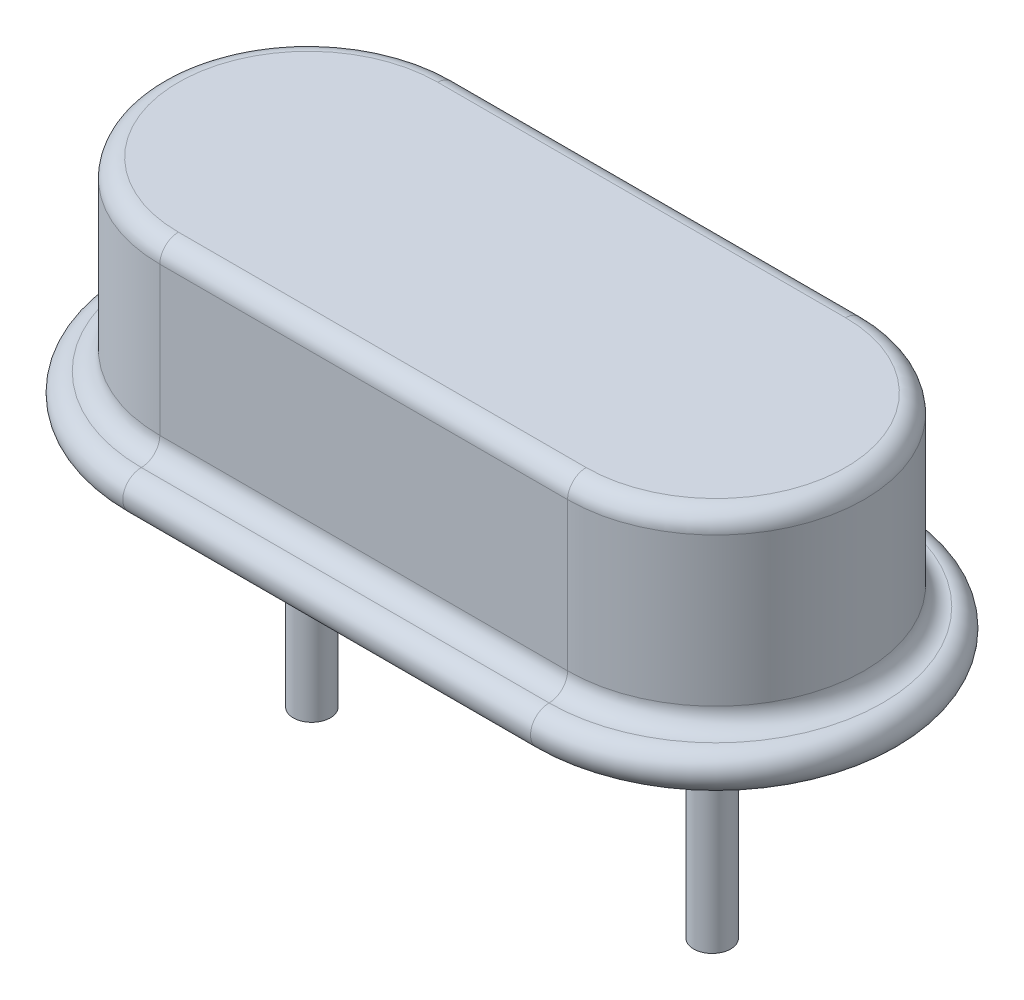
ISO-10303-21;
HEADER;
FILE_DESCRIPTION(('STEP AP214'),'2;1');
FILE_NAME('part.step','',(''),(''),'','','');
FILE_SCHEMA(('AUTOMOTIVE_DESIGN { 1 0 10303 214 1 1 1 1 }'));
ENDSEC;
DATA;
#1=APPLICATION_CONTEXT('core data for automotive mechanical design processes');
#2=APPLICATION_PROTOCOL_DEFINITION('international standard','automotive_design',2000,#1);
#3=PRODUCT_CONTEXT('',#1,'mechanical');
#4=PRODUCT('Part','Part','',(#3));
#5=PRODUCT_RELATED_PRODUCT_CATEGORY('part','',(#4));
#6=PRODUCT_DEFINITION_FORMATION('','',#4);
#7=PRODUCT_DEFINITION_CONTEXT('part definition',#1,'design');
#8=PRODUCT_DEFINITION('design','',#6,#7);
#9=PRODUCT_DEFINITION_SHAPE('','',#8);
#10=(LENGTH_UNIT() NAMED_UNIT(*) SI_UNIT(.MILLI.,.METRE.));
#11=(NAMED_UNIT(*) PLANE_ANGLE_UNIT() SI_UNIT($,.RADIAN.));
#12=(NAMED_UNIT(*) SI_UNIT($,.STERADIAN.) SOLID_ANGLE_UNIT());
#13=UNCERTAINTY_MEASURE_WITH_UNIT(LENGTH_MEASURE(1.E-05),#10,'distance_accuracy_value','');
#14=(GEOMETRIC_REPRESENTATION_CONTEXT(3) GLOBAL_UNCERTAINTY_ASSIGNED_CONTEXT((#13)) GLOBAL_UNIT_ASSIGNED_CONTEXT((#10,
#11,#12)) REPRESENTATION_CONTEXT('',''));
#15=CARTESIAN_POINT('',(0.,0.,0.));
#16=DIRECTION('',(0.,0.,1.));
#17=DIRECTION('',(1.,0.,0.));
#18=AXIS2_PLACEMENT_3D('',#15,#16,#17);
#19=CARTESIAN_POINT('',(0.,3.,0.));
#20=DIRECTION('',(0.,1.,0.));
#21=DIRECTION('',(0.,0.,1.));
#22=AXIS2_PLACEMENT_3D('',#19,#20,#21);
#23=PLANE('',#22);
#24=DIRECTION('',(-1.,0.,0.));
#25=VECTOR('',#24,1.);
#26=CARTESIAN_POINT('',(2.375,3.,-1.75));
#27=LINE('',#26,#25);
#28=CARTESIAN_POINT('',(-2.75,3.,-1.75));
#29=VERTEX_POINT('',#28);
#30=CARTESIAN_POINT('',(2.75,3.,-1.75));
#31=VERTEX_POINT('',#30);
#32=EDGE_CURVE('E110',#29,#31,#27,.F.);
#33=ORIENTED_EDGE('',*,*,#32,.F.);
#34=CARTESIAN_POINT('',(-2.75,3.,0.));
#35=DIRECTION('',(0.,-1.,0.));
#36=DIRECTION('',(0.,0.,1.));
#37=AXIS2_PLACEMENT_3D('',#34,#35,#36);
#38=CIRCLE('',#37,1.75);
#39=CARTESIAN_POINT('',(-2.75,3.,1.75));
#40=VERTEX_POINT('',#39);
#41=EDGE_CURVE('E92',#40,#29,#38,.T.);
#42=ORIENTED_EDGE('',*,*,#41,.F.);
#43=DIRECTION('',(1.,0.,0.));
#44=VECTOR('',#43,1.);
#45=CARTESIAN_POINT('',(-2.375,3.,1.75));
#46=LINE('',#45,#44);
#47=CARTESIAN_POINT('',(2.75,3.,1.75));
#48=VERTEX_POINT('',#47);
#49=EDGE_CURVE('E140',#48,#40,#46,.F.);
#50=ORIENTED_EDGE('',*,*,#49,.F.);
#51=CARTESIAN_POINT('',(2.75,3.,0.));
#52=DIRECTION('',(0.,-1.,0.));
#53=DIRECTION('',(0.,0.,-1.));
#54=AXIS2_PLACEMENT_3D('',#51,#52,#53);
#55=CIRCLE('',#54,1.75);
#56=EDGE_CURVE('E116',#31,#48,#55,.T.);
#57=ORIENTED_EDGE('',*,*,#56,.F.);
#58=EDGE_LOOP('',(#33,#42,#50,#57));
#59=FACE_BOUND('',#58,.T.);
#60=ADVANCED_FACE('F16',(#59),#23,.T.);
#61=CARTESIAN_POINT('',(-2.75,2.75,0.));
#62=DIRECTION('',(0.,-1.,0.));
#63=DIRECTION('',(0.,0.,-1.));
#64=AXIS2_PLACEMENT_3D('',#61,#62,#63);
#65=TOROIDAL_SURFACE('',#64,1.75,0.25);
#66=CARTESIAN_POINT('',(-2.75,2.75,1.75));
#67=DIRECTION('',(1.,0.,0.));
#68=DIRECTION('',(0.,0.,-1.));
#69=AXIS2_PLACEMENT_3D('',#66,#67,#68);
#70=CIRCLE('',#69,0.25);
#71=CARTESIAN_POINT('',(-2.75,2.75,2.));
#72=VERTEX_POINT('',#71);
#73=EDGE_CURVE('E99',#40,#72,#70,.T.);
#74=ORIENTED_EDGE('',*,*,#73,.F.);
#75=ORIENTED_EDGE('',*,*,#41,.T.);
#76=CARTESIAN_POINT('',(-2.75,2.75,-1.75));
#77=DIRECTION('',(-1.,0.,0.));
#78=DIRECTION('',(0.,0.,1.));
#79=AXIS2_PLACEMENT_3D('',#76,#77,#78);
#80=CIRCLE('',#79,0.25);
#81=CARTESIAN_POINT('',(-2.75,2.75,-2.));
#82=VERTEX_POINT('',#81);
#83=EDGE_CURVE('E97',#82,#29,#80,.F.);
#84=ORIENTED_EDGE('',*,*,#83,.F.);
#85=CARTESIAN_POINT('',(-2.75,2.75,0.));
#86=DIRECTION('',(0.,1.,0.));
#87=DIRECTION('',(0.,0.,1.));
#88=AXIS2_PLACEMENT_3D('',#85,#86,#87);
#89=CIRCLE('',#88,2.);
#90=EDGE_CURVE('E121',#72,#82,#89,.F.);
#91=ORIENTED_EDGE('',*,*,#90,.F.);
#92=EDGE_LOOP('',(#74,#75,#84,#91));
#93=FACE_BOUND('',#92,.T.);
#94=ADVANCED_FACE('F95',(#93),#65,.T.);
#95=CARTESIAN_POINT('',(-2.375,2.75,1.75));
#96=DIRECTION('',(1.,0.,0.));
#97=DIRECTION('',(0.,0.,-1.));
#98=AXIS2_PLACEMENT_3D('',#95,#96,#97);
#99=CYLINDRICAL_SURFACE('',#98,0.25);
#100=CARTESIAN_POINT('',(2.75,2.75,1.75));
#101=DIRECTION('',(-1.,0.,0.));
#102=DIRECTION('',(0.,0.,1.));
#103=AXIS2_PLACEMENT_3D('',#100,#101,#102);
#104=CIRCLE('',#103,0.25);
#105=CARTESIAN_POINT('',(2.75,2.75,2.));
#106=VERTEX_POINT('',#105);
#107=EDGE_CURVE('E114',#48,#106,#104,.F.);
#108=ORIENTED_EDGE('',*,*,#107,.F.);
#109=ORIENTED_EDGE('',*,*,#49,.T.);
#110=ORIENTED_EDGE('',*,*,#73,.T.);
#111=DIRECTION('',(1.,0.,0.));
#112=VECTOR('',#111,1.);
#113=CARTESIAN_POINT('',(-4.75,2.75,2.));
#114=LINE('',#113,#112);
#115=EDGE_CURVE('E179',#106,#72,#114,.F.);
#116=ORIENTED_EDGE('',*,*,#115,.F.);
#117=EDGE_LOOP('',(#108,#109,#110,#116));
#118=FACE_BOUND('',#117,.T.);
#119=ADVANCED_FACE('F164',(#118),#99,.T.);
#120=CARTESIAN_POINT('',(2.75,2.75,0.));
#121=DIRECTION('',(0.,-1.,0.));
#122=DIRECTION('',(0.,0.,-1.));
#123=AXIS2_PLACEMENT_3D('',#120,#121,#122);
#124=TOROIDAL_SURFACE('',#123,1.75,0.25);
#125=ORIENTED_EDGE('',*,*,#107,.T.);
#126=CARTESIAN_POINT('',(2.75,2.75,0.));
#127=DIRECTION('',(0.,1.,0.));
#128=DIRECTION('',(0.,0.,1.));
#129=AXIS2_PLACEMENT_3D('',#126,#127,#128);
#130=CIRCLE('',#129,2.);
#131=CARTESIAN_POINT('',(2.75,2.75,-2.));
#132=VERTEX_POINT('',#131);
#133=EDGE_CURVE('E195',#132,#106,#130,.F.);
#134=ORIENTED_EDGE('',*,*,#133,.F.);
#135=CARTESIAN_POINT('',(2.75,2.75,-1.75));
#136=DIRECTION('',(-1.,0.,0.));
#137=DIRECTION('',(0.,0.,1.));
#138=AXIS2_PLACEMENT_3D('',#135,#136,#137);
#139=CIRCLE('',#138,0.25);
#140=EDGE_CURVE('E119',#31,#132,#139,.T.);
#141=ORIENTED_EDGE('',*,*,#140,.F.);
#142=ORIENTED_EDGE('',*,*,#56,.T.);
#143=EDGE_LOOP('',(#125,#134,#141,#142));
#144=FACE_BOUND('',#143,.T.);
#145=ADVANCED_FACE('F153',(#144),#124,.T.);
#146=CARTESIAN_POINT('',(2.375,2.75,-1.75));
#147=DIRECTION('',(-1.,0.,0.));
#148=DIRECTION('',(0.,0.,1.));
#149=AXIS2_PLACEMENT_3D('',#146,#147,#148);
#150=CYLINDRICAL_SURFACE('',#149,0.25);
#151=ORIENTED_EDGE('',*,*,#140,.T.);
#152=DIRECTION('',(-1.,0.,0.));
#153=VECTOR('',#152,1.);
#154=CARTESIAN_POINT('',(4.75,2.75,-2.));
#155=LINE('',#154,#153);
#156=EDGE_CURVE('E113',#82,#132,#155,.F.);
#157=ORIENTED_EDGE('',*,*,#156,.F.);
#158=ORIENTED_EDGE('',*,*,#83,.T.);
#159=ORIENTED_EDGE('',*,*,#32,.T.);
#160=EDGE_LOOP('',(#151,#157,#158,#159));
#161=FACE_BOUND('',#160,.T.);
#162=ADVANCED_FACE('F109',(#161),#150,.T.);
#163=CARTESIAN_POINT('',(-2.75,0.,0.));
#164=DIRECTION('',(0.,1.,0.));
#165=DIRECTION('',(0.,0.,1.));
#166=AXIS2_PLACEMENT_3D('',#163,#164,#165);
#167=CYLINDRICAL_SURFACE('',#166,2.);
#168=CARTESIAN_POINT('',(-2.75,0.75,0.));
#169=DIRECTION('',(0.,1.,0.));
#170=DIRECTION('',(0.,0.,1.));
#171=AXIS2_PLACEMENT_3D('',#168,#169,#170);
#172=CIRCLE('',#171,2.);
#173=CARTESIAN_POINT('',(-2.75,0.75,-2.));
#174=VERTEX_POINT('',#173);
#175=CARTESIAN_POINT('',(-2.75,0.75,2.));
#176=VERTEX_POINT('',#175);
#177=EDGE_CURVE('E193',#174,#176,#172,.T.);
#178=ORIENTED_EDGE('',*,*,#177,.T.);
#179=DIRECTION('',(0.,1.,0.));
#180=VECTOR('',#179,1.);
#181=CARTESIAN_POINT('',(-2.75,0.,2.));
#182=LINE('',#181,#180);
#183=EDGE_CURVE('E185',#72,#176,#182,.F.);
#184=ORIENTED_EDGE('',*,*,#183,.F.);
#185=ORIENTED_EDGE('',*,*,#90,.T.);
#186=DIRECTION('',(0.,1.,0.));
#187=VECTOR('',#186,1.);
#188=CARTESIAN_POINT('',(-2.75,0.,-2.));
#189=LINE('',#188,#187);
#190=EDGE_CURVE('E218',#174,#82,#189,.T.);
#191=ORIENTED_EDGE('',*,*,#190,.F.);
#192=EDGE_LOOP('',(#178,#184,#185,#191));
#193=FACE_BOUND('',#192,.T.);
#194=ADVANCED_FACE('F192',(#193),#167,.T.);
#195=CARTESIAN_POINT('',(-4.75,0.,2.));
#196=DIRECTION('',(0.,0.,1.));
#197=DIRECTION('',(1.,0.,0.));
#198=AXIS2_PLACEMENT_3D('',#195,#196,#197);
#199=PLANE('',#198);
#200=DIRECTION('',(1.,0.,0.));
#201=VECTOR('',#200,1.);
#202=CARTESIAN_POINT('',(-2.375,0.75,2.));
#203=LINE('',#202,#201);
#204=CARTESIAN_POINT('',(2.75,0.75,2.));
#205=VERTEX_POINT('',#204);
#206=EDGE_CURVE('E226',#176,#205,#203,.T.);
#207=ORIENTED_EDGE('',*,*,#206,.T.);
#208=DIRECTION('',(0.,1.,0.));
#209=VECTOR('',#208,1.);
#210=CARTESIAN_POINT('',(2.75,0.,2.));
#211=LINE('',#210,#209);
#212=EDGE_CURVE('E187',#106,#205,#211,.F.);
#213=ORIENTED_EDGE('',*,*,#212,.F.);
#214=ORIENTED_EDGE('',*,*,#115,.T.);
#215=ORIENTED_EDGE('',*,*,#183,.T.);
#216=EDGE_LOOP('',(#207,#213,#214,#215));
#217=FACE_BOUND('',#216,.T.);
#218=ADVANCED_FACE('F183',(#217),#199,.T.);
#219=CARTESIAN_POINT('',(2.75,0.,0.));
#220=DIRECTION('',(0.,1.,0.));
#221=DIRECTION('',(0.,0.,1.));
#222=AXIS2_PLACEMENT_3D('',#219,#220,#221);
#223=CYLINDRICAL_SURFACE('',#222,2.);
#224=CARTESIAN_POINT('',(2.75,0.75,0.));
#225=DIRECTION('',(0.,1.,0.));
#226=DIRECTION('',(0.,0.,1.));
#227=AXIS2_PLACEMENT_3D('',#224,#225,#226);
#228=CIRCLE('',#227,2.);
#229=CARTESIAN_POINT('',(2.75,0.75,-2.));
#230=VERTEX_POINT('',#229);
#231=EDGE_CURVE('E246',#205,#230,#228,.T.);
#232=ORIENTED_EDGE('',*,*,#231,.T.);
#233=DIRECTION('',(0.,1.,0.));
#234=VECTOR('',#233,1.);
#235=CARTESIAN_POINT('',(2.75,0.,-2.));
#236=LINE('',#235,#234);
#237=EDGE_CURVE('E208',#132,#230,#236,.F.);
#238=ORIENTED_EDGE('',*,*,#237,.F.);
#239=ORIENTED_EDGE('',*,*,#133,.T.);
#240=ORIENTED_EDGE('',*,*,#212,.T.);
#241=EDGE_LOOP('',(#232,#238,#239,#240));
#242=FACE_BOUND('',#241,.T.);
#243=ADVANCED_FACE('F263',(#242),#223,.T.);
#244=CARTESIAN_POINT('',(4.75,0.,-2.));
#245=DIRECTION('',(0.,0.,-1.));
#246=DIRECTION('',(-1.,0.,0.));
#247=AXIS2_PLACEMENT_3D('',#244,#245,#246);
#248=PLANE('',#247);
#249=DIRECTION('',(-1.,0.,0.));
#250=VECTOR('',#249,1.);
#251=CARTESIAN_POINT('',(2.375,0.75,-2.));
#252=LINE('',#251,#250);
#253=EDGE_CURVE('E239',#230,#174,#252,.T.);
#254=ORIENTED_EDGE('',*,*,#253,.T.);
#255=ORIENTED_EDGE('',*,*,#190,.T.);
#256=ORIENTED_EDGE('',*,*,#156,.T.);
#257=ORIENTED_EDGE('',*,*,#237,.T.);
#258=EDGE_LOOP('',(#254,#255,#256,#257));
#259=FACE_BOUND('',#258,.T.);
#260=ADVANCED_FACE('F258',(#259),#248,.T.);
#261=CARTESIAN_POINT('',(-2.75,0.75,0.));
#262=DIRECTION('',(0.,1.,0.));
#263=DIRECTION('',(0.,0.,1.));
#264=AXIS2_PLACEMENT_3D('',#261,#262,#263);
#265=TOROIDAL_SURFACE('',#264,2.25,0.25);
#266=CARTESIAN_POINT('',(-2.75,0.5,0.));
#267=DIRECTION('',(0.,1.,0.));
#268=DIRECTION('',(0.,0.,1.));
#269=AXIS2_PLACEMENT_3D('',#266,#267,#268);
#270=CIRCLE('',#269,2.25);
#271=CARTESIAN_POINT('',(-2.75,0.5,2.25));
#272=VERTEX_POINT('',#271);
#273=CARTESIAN_POINT('',(-2.75,0.5,-2.25));
#274=VERTEX_POINT('',#273);
#275=EDGE_CURVE('E369',#272,#274,#270,.F.);
#276=ORIENTED_EDGE('',*,*,#275,.F.);
#277=CARTESIAN_POINT('',(-2.75,0.75,2.25));
#278=DIRECTION('',(1.,0.,0.));
#279=DIRECTION('',(0.,0.,-1.));
#280=AXIS2_PLACEMENT_3D('',#277,#278,#279);
#281=CIRCLE('',#280,0.25);
#282=EDGE_CURVE('E228',#272,#176,#281,.T.);
#283=ORIENTED_EDGE('',*,*,#282,.T.);
#284=ORIENTED_EDGE('',*,*,#177,.F.);
#285=CARTESIAN_POINT('',(-2.75,0.75,-2.25));
#286=DIRECTION('',(-1.,0.,0.));
#287=DIRECTION('',(0.,0.,1.));
#288=AXIS2_PLACEMENT_3D('',#285,#286,#287);
#289=CIRCLE('',#288,0.25);
#290=EDGE_CURVE('E242',#174,#274,#289,.F.);
#291=ORIENTED_EDGE('',*,*,#290,.T.);
#292=EDGE_LOOP('',(#276,#283,#284,#291));
#293=FACE_BOUND('',#292,.T.);
#294=ADVANCED_FACE('F253',(#293),#265,.F.);
#295=CARTESIAN_POINT('',(-2.375,0.75,2.25));
#296=DIRECTION('',(1.,0.,0.));
#297=DIRECTION('',(0.,0.,-1.));
#298=AXIS2_PLACEMENT_3D('',#295,#296,#297);
#299=CYLINDRICAL_SURFACE('',#298,0.25);
#300=DIRECTION('',(1.,0.,0.));
#301=VECTOR('',#300,1.);
#302=CARTESIAN_POINT('',(-2.625,0.5,2.25));
#303=LINE('',#302,#301);
#304=CARTESIAN_POINT('',(2.75,0.5,2.25));
#305=VERTEX_POINT('',#304);
#306=EDGE_CURVE('E352',#305,#272,#303,.F.);
#307=ORIENTED_EDGE('',*,*,#306,.F.);
#308=CARTESIAN_POINT('',(2.75,0.75,2.25));
#309=DIRECTION('',(1.,0.,0.));
#310=DIRECTION('',(0.,0.,1.));
#311=AXIS2_PLACEMENT_3D('',#308,#309,#310);
#312=CIRCLE('',#311,0.25);
#313=EDGE_CURVE('E243',#305,#205,#312,.T.);
#314=ORIENTED_EDGE('',*,*,#313,.T.);
#315=ORIENTED_EDGE('',*,*,#206,.F.);
#316=ORIENTED_EDGE('',*,*,#282,.F.);
#317=EDGE_LOOP('',(#307,#314,#315,#316));
#318=FACE_BOUND('',#317,.T.);
#319=ADVANCED_FACE('F257',(#318),#299,.F.);
#320=CARTESIAN_POINT('',(2.75,0.75,0.));
#321=DIRECTION('',(0.,1.,0.));
#322=DIRECTION('',(0.,0.,1.));
#323=AXIS2_PLACEMENT_3D('',#320,#321,#322);
#324=TOROIDAL_SURFACE('',#323,2.25,0.25);
#325=CARTESIAN_POINT('',(2.75,0.5,0.));
#326=DIRECTION('',(0.,1.,0.));
#327=DIRECTION('',(0.,0.,1.));
#328=AXIS2_PLACEMENT_3D('',#325,#326,#327);
#329=CIRCLE('',#328,2.25);
#330=CARTESIAN_POINT('',(2.75,0.5,-2.25));
#331=VERTEX_POINT('',#330);
#332=EDGE_CURVE('E347',#331,#305,#329,.F.);
#333=ORIENTED_EDGE('',*,*,#332,.F.);
#334=CARTESIAN_POINT('',(2.75,0.75,-2.25));
#335=DIRECTION('',(-1.,0.,0.));
#336=DIRECTION('',(0.,0.,1.));
#337=AXIS2_PLACEMENT_3D('',#334,#335,#336);
#338=CIRCLE('',#337,0.25);
#339=EDGE_CURVE('E376',#331,#230,#338,.T.);
#340=ORIENTED_EDGE('',*,*,#339,.T.);
#341=ORIENTED_EDGE('',*,*,#231,.F.);
#342=ORIENTED_EDGE('',*,*,#313,.F.);
#343=EDGE_LOOP('',(#333,#340,#341,#342));
#344=FACE_BOUND('',#343,.T.);
#345=ADVANCED_FACE('F401',(#344),#324,.F.);
#346=CARTESIAN_POINT('',(2.375,0.75,-2.25));
#347=DIRECTION('',(-1.,0.,0.));
#348=DIRECTION('',(0.,0.,1.));
#349=AXIS2_PLACEMENT_3D('',#346,#347,#348);
#350=CYLINDRICAL_SURFACE('',#349,0.25);
#351=DIRECTION('',(-1.,0.,0.));
#352=VECTOR('',#351,1.);
#353=CARTESIAN_POINT('',(2.625,0.5,-2.25));
#354=LINE('',#353,#352);
#355=EDGE_CURVE('E321',#274,#331,#354,.F.);
#356=ORIENTED_EDGE('',*,*,#355,.F.);
#357=ORIENTED_EDGE('',*,*,#290,.F.);
#358=ORIENTED_EDGE('',*,*,#253,.F.);
#359=ORIENTED_EDGE('',*,*,#339,.F.);
#360=EDGE_LOOP('',(#356,#357,#358,#359));
#361=FACE_BOUND('',#360,.T.);
#362=ADVANCED_FACE('F404',(#361),#350,.F.);
#363=CARTESIAN_POINT('',(2.7,-3.4,0.));
#364=DIRECTION('',(0.,-1.,0.));
#365=DIRECTION('',(0.,0.,-1.));
#366=AXIS2_PLACEMENT_3D('',#363,#364,#365);
#367=PLANE('',#366);
#368=CARTESIAN_POINT('',(2.7,-3.4,0.));
#369=DIRECTION('',(0.,-1.,0.));
#370=DIRECTION('',(0.,0.,-1.));
#371=AXIS2_PLACEMENT_3D('',#368,#369,#370);
#372=CIRCLE('',#371,0.25);
#373=CARTESIAN_POINT('',(2.7,-3.4,-0.25));
#374=VERTEX_POINT('',#373);
#375=EDGE_CURVE('E20',#374,#374,#372,.F.);
#376=ORIENTED_EDGE('',*,*,#375,.F.);
#377=EDGE_LOOP('',(#376));
#378=FACE_BOUND('',#377,.T.);
#379=ADVANCED_FACE('F407',(#378),#367,.T.);
#380=CARTESIAN_POINT('',(-2.7,-3.4,0.));
#381=DIRECTION('',(0.,-1.,0.));
#382=DIRECTION('',(0.,0.,-1.));
#383=AXIS2_PLACEMENT_3D('',#380,#381,#382);
#384=PLANE('',#383);
#385=CARTESIAN_POINT('',(-2.7,-3.4,0.));
#386=DIRECTION('',(0.,-1.,0.));
#387=DIRECTION('',(0.,0.,-1.));
#388=AXIS2_PLACEMENT_3D('',#385,#386,#387);
#389=CIRCLE('',#388,0.25);
#390=CARTESIAN_POINT('',(-2.7,-3.4,-0.25));
#391=VERTEX_POINT('',#390);
#392=EDGE_CURVE('E418',#391,#391,#389,.F.);
#393=ORIENTED_EDGE('',*,*,#392,.F.);
#394=EDGE_LOOP('',(#393));
#395=FACE_BOUND('',#394,.T.);
#396=ADVANCED_FACE('F363',(#395),#384,.T.);
#397=CARTESIAN_POINT('',(-2.75,0.25,0.));
#398=DIRECTION('',(0.,1.,0.));
#399=DIRECTION('',(0.,0.,1.));
#400=AXIS2_PLACEMENT_3D('',#397,#398,#399);
#401=TOROIDAL_SURFACE('',#400,2.25,0.25);
#402=CARTESIAN_POINT('',(-2.75,0.25,-2.25));
#403=DIRECTION('',(-1.,0.,0.));
#404=DIRECTION('',(0.,0.,1.));
#405=AXIS2_PLACEMENT_3D('',#402,#403,#404);
#406=CIRCLE('',#405,0.25);
#407=CARTESIAN_POINT('',(-2.75,0.,-2.25));
#408=VERTEX_POINT('',#407);
#409=EDGE_CURVE('E315',#408,#274,#406,.F.);
#410=ORIENTED_EDGE('',*,*,#409,.F.);
#411=CARTESIAN_POINT('',(-2.75,0.,0.));
#412=DIRECTION('',(0.,1.,0.));
#413=DIRECTION('',(0.,0.,-1.));
#414=AXIS2_PLACEMENT_3D('',#411,#412,#413);
#415=CIRCLE('',#414,2.25);
#416=CARTESIAN_POINT('',(-2.75,0.,2.25));
#417=VERTEX_POINT('',#416);
#418=EDGE_CURVE('E311',#408,#417,#415,.T.);
#419=ORIENTED_EDGE('',*,*,#418,.T.);
#420=CARTESIAN_POINT('',(-2.75,0.25,2.25));
#421=DIRECTION('',(1.,0.,0.));
#422=DIRECTION('',(0.,0.,-1.));
#423=AXIS2_PLACEMENT_3D('',#420,#421,#422);
#424=CIRCLE('',#423,0.25);
#425=EDGE_CURVE('E350',#272,#417,#424,.T.);
#426=ORIENTED_EDGE('',*,*,#425,.F.);
#427=ORIENTED_EDGE('',*,*,#275,.T.);
#428=EDGE_LOOP('',(#410,#419,#426,#427));
#429=FACE_BOUND('',#428,.T.);
#430=ADVANCED_FACE('F359',(#429),#401,.T.);
#431=CARTESIAN_POINT('',(-2.625,0.25,2.25));
#432=DIRECTION('',(1.,0.,0.));
#433=DIRECTION('',(0.,0.,-1.));
#434=AXIS2_PLACEMENT_3D('',#431,#432,#433);
#435=CYLINDRICAL_SURFACE('',#434,0.25);
#436=ORIENTED_EDGE('',*,*,#425,.T.);
#437=DIRECTION('',(1.,0.,0.));
#438=VECTOR('',#437,1.);
#439=CARTESIAN_POINT('',(0.,0.,2.25));
#440=LINE('',#439,#438);
#441=CARTESIAN_POINT('',(2.75,0.,2.25));
#442=VERTEX_POINT('',#441);
#443=EDGE_CURVE('E308',#417,#442,#440,.T.);
#444=ORIENTED_EDGE('',*,*,#443,.T.);
#445=CARTESIAN_POINT('',(2.75,0.25,2.25));
#446=DIRECTION('',(1.,0.,0.));
#447=DIRECTION('',(0.,0.,1.));
#448=AXIS2_PLACEMENT_3D('',#445,#446,#447);
#449=CIRCLE('',#448,0.25);
#450=EDGE_CURVE('E316',#305,#442,#449,.T.);
#451=ORIENTED_EDGE('',*,*,#450,.F.);
#452=ORIENTED_EDGE('',*,*,#306,.T.);
#453=EDGE_LOOP('',(#436,#444,#451,#452));
#454=FACE_BOUND('',#453,.T.);
#455=ADVANCED_FACE('F335',(#454),#435,.T.);
#456=CARTESIAN_POINT('',(2.75,0.25,0.));
#457=DIRECTION('',(0.,1.,0.));
#458=DIRECTION('',(0.,0.,1.));
#459=AXIS2_PLACEMENT_3D('',#456,#457,#458);
#460=TOROIDAL_SURFACE('',#459,2.25,0.25);
#461=ORIENTED_EDGE('',*,*,#450,.T.);
#462=CARTESIAN_POINT('',(2.75,0.,0.));
#463=DIRECTION('',(0.,1.,0.));
#464=DIRECTION('',(0.,0.,1.));
#465=AXIS2_PLACEMENT_3D('',#462,#463,#464);
#466=CIRCLE('',#465,2.25);
#467=CARTESIAN_POINT('',(2.75,0.,-2.25));
#468=VERTEX_POINT('',#467);
#469=EDGE_CURVE('E305',#442,#468,#466,.T.);
#470=ORIENTED_EDGE('',*,*,#469,.T.);
#471=CARTESIAN_POINT('',(2.75,0.25,-2.25));
#472=DIRECTION('',(-1.,0.,0.));
#473=DIRECTION('',(0.,0.,1.));
#474=AXIS2_PLACEMENT_3D('',#471,#472,#473);
#475=CIRCLE('',#474,0.25);
#476=EDGE_CURVE('E35',#331,#468,#475,.T.);
#477=ORIENTED_EDGE('',*,*,#476,.F.);
#478=ORIENTED_EDGE('',*,*,#332,.T.);
#479=EDGE_LOOP('',(#461,#470,#477,#478));
#480=FACE_BOUND('',#479,.T.);
#481=ADVANCED_FACE('F329',(#480),#460,.T.);
#482=CARTESIAN_POINT('',(2.625,0.25,-2.25));
#483=DIRECTION('',(-1.,0.,0.));
#484=DIRECTION('',(0.,0.,1.));
#485=AXIS2_PLACEMENT_3D('',#482,#483,#484);
#486=CYLINDRICAL_SURFACE('',#485,0.25);
#487=ORIENTED_EDGE('',*,*,#409,.T.);
#488=ORIENTED_EDGE('',*,*,#355,.T.);
#489=ORIENTED_EDGE('',*,*,#476,.T.);
#490=DIRECTION('',(1.,0.,0.));
#491=VECTOR('',#490,1.);
#492=CARTESIAN_POINT('',(0.,0.,-2.25));
#493=LINE('',#492,#491);
#494=EDGE_CURVE('E298',#468,#408,#493,.F.);
#495=ORIENTED_EDGE('',*,*,#494,.T.);
#496=EDGE_LOOP('',(#487,#488,#489,#495));
#497=FACE_BOUND('',#496,.T.);
#498=ADVANCED_FACE('F334',(#497),#486,.T.);
#499=CARTESIAN_POINT('',(2.7,0.,0.));
#500=DIRECTION('',(0.,-1.,0.));
#501=DIRECTION('',(0.,0.,-1.));
#502=AXIS2_PLACEMENT_3D('',#499,#500,#501);
#503=CYLINDRICAL_SURFACE('',#502,0.25);
#504=CARTESIAN_POINT('',(2.7,0.,0.));
#505=DIRECTION('',(0.,-1.,0.));
#506=DIRECTION('',(0.,0.,-1.));
#507=AXIS2_PLACEMENT_3D('',#504,#505,#506);
#508=CIRCLE('',#507,0.25);
#509=CARTESIAN_POINT('',(2.7,0.,-0.25));
#510=VERTEX_POINT('',#509);
#511=EDGE_CURVE('E26',#510,#510,#508,.T.);
#512=ORIENTED_EDGE('',*,*,#511,.T.);
#513=EDGE_LOOP('',(#512));
#514=FACE_BOUND('',#513,.T.);
#515=ORIENTED_EDGE('',*,*,#375,.T.);
#516=EDGE_LOOP('',(#515));
#517=FACE_BOUND('',#516,.T.);
#518=ADVANCED_FACE('F280',(#514,#517),#503,.T.);
#519=CARTESIAN_POINT('',(-2.7,0.,0.));
#520=DIRECTION('',(0.,-1.,0.));
#521=DIRECTION('',(0.,0.,-1.));
#522=AXIS2_PLACEMENT_3D('',#519,#520,#521);
#523=CYLINDRICAL_SURFACE('',#522,0.25);
#524=CARTESIAN_POINT('',(-2.7,0.,0.));
#525=DIRECTION('',(0.,-1.,0.));
#526=DIRECTION('',(0.,0.,-1.));
#527=AXIS2_PLACEMENT_3D('',#524,#525,#526);
#528=CIRCLE('',#527,0.25);
#529=CARTESIAN_POINT('',(-2.7,0.,-0.25));
#530=VERTEX_POINT('',#529);
#531=EDGE_CURVE('E11',#530,#530,#528,.T.);
#532=ORIENTED_EDGE('',*,*,#531,.T.);
#533=EDGE_LOOP('',(#532));
#534=FACE_BOUND('',#533,.T.);
#535=ORIENTED_EDGE('',*,*,#392,.T.);
#536=EDGE_LOOP('',(#535));
#537=FACE_BOUND('',#536,.T.);
#538=ADVANCED_FACE('F274',(#534,#537),#523,.T.);
#539=CARTESIAN_POINT('',(0.,0.,0.));
#540=DIRECTION('',(0.,1.,0.));
#541=DIRECTION('',(0.,0.,1.));
#542=AXIS2_PLACEMENT_3D('',#539,#540,#541);
#543=PLANE('',#542);
#544=ORIENTED_EDGE('',*,*,#531,.F.);
#545=EDGE_LOOP('',(#544));
#546=FACE_BOUND('',#545,.T.);
#547=ORIENTED_EDGE('',*,*,#511,.F.);
#548=EDGE_LOOP('',(#547));
#549=FACE_BOUND('',#548,.T.);
#550=ORIENTED_EDGE('',*,*,#469,.F.);
#551=ORIENTED_EDGE('',*,*,#443,.F.);
#552=ORIENTED_EDGE('',*,*,#418,.F.);
#553=ORIENTED_EDGE('',*,*,#494,.F.);
#554=EDGE_LOOP('',(#550,#551,#552,#553));
#555=FACE_BOUND('',#554,.T.);
#556=ADVANCED_FACE('F272',(#546,#549,#555),#543,.F.);
#557=CLOSED_SHELL('',(#60,#94,#119,#145,#162,#194,#218,#243,#260,#294,#319,#345,#362,#379,#396,
#430,#455,#481,#498,#518,#538,#556));
#558=MANIFOLD_SOLID_BREP('B1',#557);
#559=ADVANCED_BREP_SHAPE_REPRESENTATION('',(#18,#558),#14);
#560=SHAPE_DEFINITION_REPRESENTATION(#9,#559);
ENDSEC;
END-ISO-10303-21;
